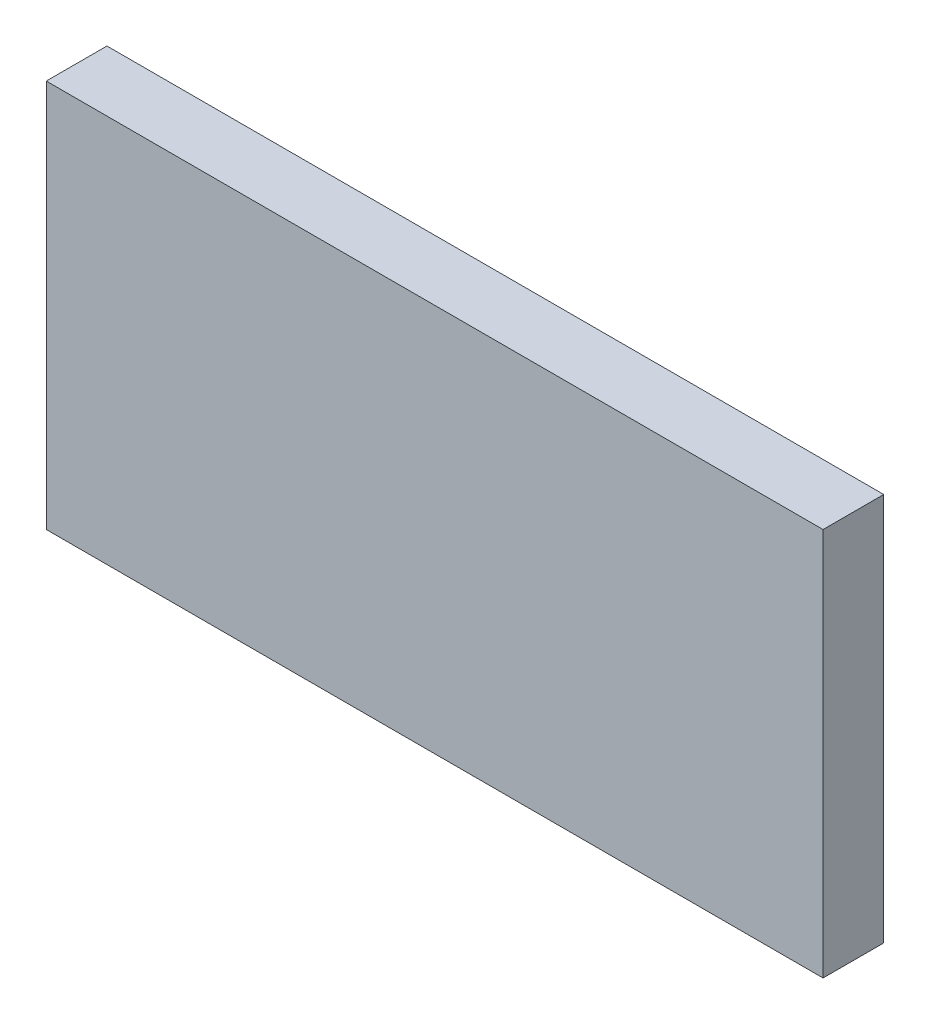
ISO-10303-21;
HEADER;
FILE_DESCRIPTION(('STEP AP214'),'2;1');
FILE_NAME('part.step','',(''),(''),'','','');
FILE_SCHEMA(('AUTOMOTIVE_DESIGN { 1 0 10303 214 1 1 1 1 }'));
ENDSEC;
DATA;
#1=APPLICATION_CONTEXT('core data for automotive mechanical design processes');
#2=APPLICATION_PROTOCOL_DEFINITION('international standard','automotive_design',2000,#1);
#3=PRODUCT_CONTEXT('',#1,'mechanical');
#4=PRODUCT('Part','Part','',(#3));
#5=PRODUCT_RELATED_PRODUCT_CATEGORY('part','',(#4));
#6=PRODUCT_DEFINITION_FORMATION('','',#4);
#7=PRODUCT_DEFINITION_CONTEXT('part definition',#1,'design');
#8=PRODUCT_DEFINITION('design','',#6,#7);
#9=PRODUCT_DEFINITION_SHAPE('','',#8);
#10=(LENGTH_UNIT() NAMED_UNIT(*) SI_UNIT(.MILLI.,.METRE.));
#11=(NAMED_UNIT(*) PLANE_ANGLE_UNIT() SI_UNIT($,.RADIAN.));
#12=(NAMED_UNIT(*) SI_UNIT($,.STERADIAN.) SOLID_ANGLE_UNIT());
#13=UNCERTAINTY_MEASURE_WITH_UNIT(LENGTH_MEASURE(1.E-05),#10,'distance_accuracy_value','');
#14=(GEOMETRIC_REPRESENTATION_CONTEXT(3) GLOBAL_UNCERTAINTY_ASSIGNED_CONTEXT((#13)) GLOBAL_UNIT_ASSIGNED_CONTEXT((#10,
#11,#12)) REPRESENTATION_CONTEXT('',''));
#15=CARTESIAN_POINT('',(0.,0.,0.));
#16=DIRECTION('',(0.,0.,1.));
#17=DIRECTION('',(1.,0.,0.));
#18=AXIS2_PLACEMENT_3D('',#15,#16,#17);
#19=CARTESIAN_POINT('',(32.,16.,5.));
#20=DIRECTION('',(-1.,0.,0.));
#21=DIRECTION('',(0.,-1.,0.));
#22=AXIS2_PLACEMENT_3D('',#19,#20,#21);
#23=PLANE('',#22);
#24=DIRECTION('',(0.,1.,0.));
#25=VECTOR('',#24,1.);
#26=CARTESIAN_POINT('',(32.,16.,0.));
#27=LINE('',#26,#25);
#28=CARTESIAN_POINT('',(32.,-16.,0.));
#29=VERTEX_POINT('',#28);
#30=CARTESIAN_POINT('',(32.,16.,0.));
#31=VERTEX_POINT('',#30);
#32=EDGE_CURVE('E107',#29,#31,#27,.T.);
#33=ORIENTED_EDGE('',*,*,#32,.T.);
#34=DIRECTION('',(0.,0.,-1.));
#35=VECTOR('',#34,1.);
#36=CARTESIAN_POINT('',(32.,16.,5.));
#37=LINE('',#36,#35);
#38=CARTESIAN_POINT('',(32.,16.,5.));
#39=VERTEX_POINT('',#38);
#40=EDGE_CURVE('E11',#39,#31,#37,.T.);
#41=ORIENTED_EDGE('',*,*,#40,.F.);
#42=DIRECTION('',(0.,1.,0.));
#43=VECTOR('',#42,1.);
#44=CARTESIAN_POINT('',(32.,16.,5.));
#45=LINE('',#44,#43);
#46=CARTESIAN_POINT('',(32.,-16.,5.));
#47=VERTEX_POINT('',#46);
#48=EDGE_CURVE('E91',#47,#39,#45,.T.);
#49=ORIENTED_EDGE('',*,*,#48,.F.);
#50=DIRECTION('',(0.,0.,-1.));
#51=VECTOR('',#50,1.);
#52=CARTESIAN_POINT('',(32.,-16.,5.));
#53=LINE('',#52,#51);
#54=EDGE_CURVE('E103',#47,#29,#53,.T.);
#55=ORIENTED_EDGE('',*,*,#54,.T.);
#56=EDGE_LOOP('',(#33,#41,#49,#55));
#57=FACE_BOUND('',#56,.T.);
#58=ADVANCED_FACE('F39',(#57),#23,.F.);
#59=CARTESIAN_POINT('',(-32.,16.,5.));
#60=DIRECTION('',(0.,-1.,0.));
#61=DIRECTION('',(0.,0.,-1.));
#62=AXIS2_PLACEMENT_3D('',#59,#60,#61);
#63=PLANE('',#62);
#64=DIRECTION('',(-1.,0.,0.));
#65=VECTOR('',#64,1.);
#66=CARTESIAN_POINT('',(-32.,16.,0.));
#67=LINE('',#66,#65);
#68=CARTESIAN_POINT('',(-32.,16.,0.));
#69=VERTEX_POINT('',#68);
#70=EDGE_CURVE('E96',#31,#69,#67,.T.);
#71=ORIENTED_EDGE('',*,*,#70,.T.);
#72=DIRECTION('',(0.,0.,-1.));
#73=VECTOR('',#72,1.);
#74=CARTESIAN_POINT('',(-32.,16.,5.));
#75=LINE('',#74,#73);
#76=CARTESIAN_POINT('',(-32.,16.,5.));
#77=VERTEX_POINT('',#76);
#78=EDGE_CURVE('E48',#77,#69,#75,.T.);
#79=ORIENTED_EDGE('',*,*,#78,.F.);
#80=DIRECTION('',(-1.,0.,0.));
#81=VECTOR('',#80,1.);
#82=CARTESIAN_POINT('',(-32.,16.,5.));
#83=LINE('',#82,#81);
#84=EDGE_CURVE('E86',#39,#77,#83,.T.);
#85=ORIENTED_EDGE('',*,*,#84,.F.);
#86=ORIENTED_EDGE('',*,*,#40,.T.);
#87=EDGE_LOOP('',(#71,#79,#85,#86));
#88=FACE_BOUND('',#87,.T.);
#89=ADVANCED_FACE('F95',(#88),#63,.F.);
#90=CARTESIAN_POINT('',(-32.,16.,5.));
#91=DIRECTION('',(1.,0.,0.));
#92=DIRECTION('',(0.,1.,0.));
#93=AXIS2_PLACEMENT_3D('',#90,#91,#92);
#94=PLANE('',#93);
#95=DIRECTION('',(0.,-1.,0.));
#96=VECTOR('',#95,1.);
#97=CARTESIAN_POINT('',(-32.,16.,0.));
#98=LINE('',#97,#96);
#99=CARTESIAN_POINT('',(-32.,-16.,0.));
#100=VERTEX_POINT('',#99);
#101=EDGE_CURVE('E73',#69,#100,#98,.T.);
#102=ORIENTED_EDGE('',*,*,#101,.T.);
#103=DIRECTION('',(0.,0.,-1.));
#104=VECTOR('',#103,1.);
#105=CARTESIAN_POINT('',(-32.,-16.,5.));
#106=LINE('',#105,#104);
#107=CARTESIAN_POINT('',(-32.,-16.,5.));
#108=VERTEX_POINT('',#107);
#109=EDGE_CURVE('E98',#108,#100,#106,.T.);
#110=ORIENTED_EDGE('',*,*,#109,.F.);
#111=DIRECTION('',(0.,-1.,0.));
#112=VECTOR('',#111,1.);
#113=CARTESIAN_POINT('',(-32.,16.,5.));
#114=LINE('',#113,#112);
#115=EDGE_CURVE('E89',#77,#108,#114,.T.);
#116=ORIENTED_EDGE('',*,*,#115,.F.);
#117=ORIENTED_EDGE('',*,*,#78,.T.);
#118=EDGE_LOOP('',(#102,#110,#116,#117));
#119=FACE_BOUND('',#118,.T.);
#120=ADVANCED_FACE('F99',(#119),#94,.F.);
#121=CARTESIAN_POINT('',(-32.,-16.,5.));
#122=DIRECTION('',(0.,1.,0.));
#123=DIRECTION('',(0.,0.,1.));
#124=AXIS2_PLACEMENT_3D('',#121,#122,#123);
#125=PLANE('',#124);
#126=DIRECTION('',(1.,0.,0.));
#127=VECTOR('',#126,1.);
#128=CARTESIAN_POINT('',(-32.,-16.,0.));
#129=LINE('',#128,#127);
#130=EDGE_CURVE('E79',#100,#29,#129,.T.);
#131=ORIENTED_EDGE('',*,*,#130,.T.);
#132=ORIENTED_EDGE('',*,*,#54,.F.);
#133=DIRECTION('',(1.,0.,0.));
#134=VECTOR('',#133,1.);
#135=CARTESIAN_POINT('',(-32.,-16.,5.));
#136=LINE('',#135,#134);
#137=EDGE_CURVE('E56',#108,#47,#136,.T.);
#138=ORIENTED_EDGE('',*,*,#137,.F.);
#139=ORIENTED_EDGE('',*,*,#109,.T.);
#140=EDGE_LOOP('',(#131,#132,#138,#139));
#141=FACE_BOUND('',#140,.T.);
#142=ADVANCED_FACE('F120',(#141),#125,.F.);
#143=CARTESIAN_POINT('',(0.,0.,5.));
#144=DIRECTION('',(0.,0.,1.));
#145=DIRECTION('',(1.,0.,0.));
#146=AXIS2_PLACEMENT_3D('',#143,#144,#145);
#147=PLANE('',#146);
#148=ORIENTED_EDGE('',*,*,#48,.T.);
#149=ORIENTED_EDGE('',*,*,#84,.T.);
#150=ORIENTED_EDGE('',*,*,#115,.T.);
#151=ORIENTED_EDGE('',*,*,#137,.T.);
#152=EDGE_LOOP('',(#148,#149,#150,#151));
#153=FACE_BOUND('',#152,.T.);
#154=ADVANCED_FACE('F87',(#153),#147,.T.);
#155=CARTESIAN_POINT('',(0.,0.,0.));
#156=DIRECTION('',(0.,0.,1.));
#157=DIRECTION('',(1.,0.,0.));
#158=AXIS2_PLACEMENT_3D('',#155,#156,#157);
#159=PLANE('',#158);
#160=ORIENTED_EDGE('',*,*,#32,.F.);
#161=ORIENTED_EDGE('',*,*,#130,.F.);
#162=ORIENTED_EDGE('',*,*,#101,.F.);
#163=ORIENTED_EDGE('',*,*,#70,.F.);
#164=EDGE_LOOP('',(#160,#161,#162,#163));
#165=FACE_BOUND('',#164,.T.);
#166=ADVANCED_FACE('F123',(#165),#159,.F.);
#167=CLOSED_SHELL('',(#58,#89,#120,#142,#154,#166));
#168=MANIFOLD_SOLID_BREP('B2',#167);
#169=ADVANCED_BREP_SHAPE_REPRESENTATION('',(#18,#168),#14);
#170=SHAPE_DEFINITION_REPRESENTATION(#9,#169);
ENDSEC;
END-ISO-10303-21;
